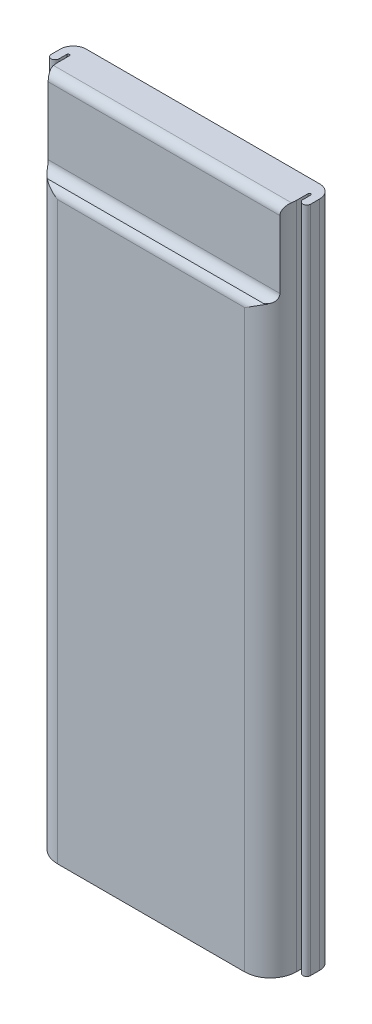
ISO-10303-21;
HEADER;
FILE_DESCRIPTION(('STEP AP214'),'2;1');
FILE_NAME('part.step','',(''),(''),'','','');
FILE_SCHEMA(('AUTOMOTIVE_DESIGN { 1 0 10303 214 1 1 1 1 }'));
ENDSEC;
DATA;
#1=APPLICATION_CONTEXT('core data for automotive mechanical design processes');
#2=APPLICATION_PROTOCOL_DEFINITION('international standard','automotive_design',2000,#1);
#3=PRODUCT_CONTEXT('',#1,'mechanical');
#4=PRODUCT('Part','Part','',(#3));
#5=PRODUCT_RELATED_PRODUCT_CATEGORY('part','',(#4));
#6=PRODUCT_DEFINITION_FORMATION('','',#4);
#7=PRODUCT_DEFINITION_CONTEXT('part definition',#1,'design');
#8=PRODUCT_DEFINITION('design','',#6,#7);
#9=PRODUCT_DEFINITION_SHAPE('','',#8);
#10=(LENGTH_UNIT() NAMED_UNIT(*) SI_UNIT(.MILLI.,.METRE.));
#11=(NAMED_UNIT(*) PLANE_ANGLE_UNIT() SI_UNIT($,.RADIAN.));
#12=(NAMED_UNIT(*) SI_UNIT($,.STERADIAN.) SOLID_ANGLE_UNIT());
#13=UNCERTAINTY_MEASURE_WITH_UNIT(LENGTH_MEASURE(1.E-05),#10,'distance_accuracy_value','');
#14=(GEOMETRIC_REPRESENTATION_CONTEXT(3) GLOBAL_UNCERTAINTY_ASSIGNED_CONTEXT((#13)) GLOBAL_UNIT_ASSIGNED_CONTEXT((#10,
#11,#12)) REPRESENTATION_CONTEXT('',''));
#15=CARTESIAN_POINT('',(0.,0.,0.));
#16=DIRECTION('',(0.,0.,1.));
#17=DIRECTION('',(1.,0.,0.));
#18=AXIS2_PLACEMENT_3D('',#15,#16,#17);
#19=CARTESIAN_POINT('',(-7.2,25.75,2.));
#20=DIRECTION('',(0.,-1.,0.));
#21=DIRECTION('',(0.,0.,-1.));
#22=AXIS2_PLACEMENT_3D('',#19,#20,#21);
#23=CYLINDRICAL_SURFACE('',#22,2.);
#24=CARTESIAN_POINT('',(-9.16913686675152,25.75,2.35));
#25=CARTESIAN_POINT('',(-9.16256093449206,25.7500258423735,2.38720826317085));
#26=CARTESIAN_POINT('',(-9.15486940976689,25.7468086891483,2.4241591284709));
#27=CARTESIAN_POINT('',(-9.13774343495875,25.7343318443298,2.49647410047727));
#28=CARTESIAN_POINT('',(-9.12831529903657,25.7250937449853,2.53184339647987));
#29=CARTESIAN_POINT('',(-9.10816469703338,25.7010290291053,2.6001553701829));
#30=CARTESIAN_POINT('',(-9.09744401727403,25.6862100665892,2.6331012978363));
#31=CARTESIAN_POINT('',(-9.0753021283148,25.6514586581588,2.69595344895339));
#32=CARTESIAN_POINT('',(-9.06388022167456,25.6315210564394,2.72585656485584));
#33=CARTESIAN_POINT('',(-9.04042958181792,25.5858190182926,2.78347824411278));
#34=CARTESIAN_POINT('',(-9.02840083308985,25.5598013830623,2.8109964779475));
#35=CARTESIAN_POINT('',(-9.00525838569287,25.5031420891217,2.86128360696459));
#36=CARTESIAN_POINT('',(-8.99414495701818,25.4724990735485,2.88405110382572));
#37=CARTESIAN_POINT('',(-8.97386355202712,25.4072504672174,2.92407369196035));
#38=CARTESIAN_POINT('',(-8.96469354608749,25.3726490691685,2.9413345437444));
#39=CARTESIAN_POINT('',(-8.94935335516006,25.3003858909545,2.9695485909417));
#40=CARTESIAN_POINT('',(-8.94317547200441,25.2627322584751,2.98051798664042));
#41=CARTESIAN_POINT('',(-8.93665873920537,25.2038592489191,2.99198602933503));
#42=CARTESIAN_POINT('',(-8.93494021604257,25.1832492223571,2.99498291355548));
#43=CARTESIAN_POINT('',(-8.93263293443128,25.1417652075219,2.99899212215603));
#44=CARTESIAN_POINT('',(-8.93204471811952,25.1208910974135,3.00000349421653));
#45=CARTESIAN_POINT('',(-8.93205080756888,25.1,3.));
#46=B_SPLINE_CURVE_WITH_KNOTS('',3,(#24,#25,#26,#27,#28,#29,#30,#31,#32,#33,#34,#35,#36,#37,#38,
#39,#40,#41,#42,#43,#44,#45),.UNSPECIFIED.,.F.,.F.,(4,2,2,2,2,2,2,2,2,2,4),(0.,
0.113115292878996,0.225827148620393,0.338384982404669,0.45105663917476,0.569711468956826,
0.688401174223788,0.806966307735266,0.925224753327533,0.98780357331846,1.05041240092788),.UNSPECIFIED.);
#47=CARTESIAN_POINT('',(-9.16913686675152,25.75,2.35));
#48=VERTEX_POINT('',#47);
#49=CARTESIAN_POINT('',(-8.93205080756888,25.1,3.));
#50=VERTEX_POINT('',#49);
#51=EDGE_CURVE('E361',#48,#50,#46,.T.);
#52=ORIENTED_EDGE('',*,*,#51,.F.);
#53=CARTESIAN_POINT('',(-7.2,25.75,2.));
#54=DIRECTION('',(0.,1.,0.));
#55=DIRECTION('',(0.,0.,1.));
#56=AXIS2_PLACEMENT_3D('',#53,#54,#55);
#57=CIRCLE('',#56,2.);
#58=CARTESIAN_POINT('',(-9.2,25.75,2.));
#59=VERTEX_POINT('',#58);
#60=EDGE_CURVE('E276',#59,#48,#57,.T.);
#61=ORIENTED_EDGE('',*,*,#60,.F.);
#62=DIRECTION('',(0.,-1.,0.));
#63=VECTOR('',#62,1.);
#64=CARTESIAN_POINT('',(-9.2,25.75,2.));
#65=LINE('',#64,#63);
#66=CARTESIAN_POINT('',(-9.2,-25.75,2.));
#67=VERTEX_POINT('',#66);
#68=EDGE_CURVE('E239',#59,#67,#65,.T.);
#69=ORIENTED_EDGE('',*,*,#68,.T.);
#70=CARTESIAN_POINT('',(-7.2,-25.75,2.));
#71=DIRECTION('',(0.,1.,0.));
#72=DIRECTION('',(0.,0.,1.));
#73=AXIS2_PLACEMENT_3D('',#70,#71,#72);
#74=CIRCLE('',#73,2.);
#75=CARTESIAN_POINT('',(-7.2,-25.75,4.));
#76=VERTEX_POINT('',#75);
#77=EDGE_CURVE('E199',#67,#76,#74,.T.);
#78=ORIENTED_EDGE('',*,*,#77,.T.);
#79=DIRECTION('',(0.,-1.,0.));
#80=VECTOR('',#79,1.);
#81=CARTESIAN_POINT('',(-7.2,25.75,4.));
#82=LINE('',#81,#80);
#83=CARTESIAN_POINT('',(-7.2,18.6,4.));
#84=VERTEX_POINT('',#83);
#85=EDGE_CURVE('E237',#84,#76,#82,.T.);
#86=ORIENTED_EDGE('',*,*,#85,.F.);
#87=CARTESIAN_POINT('',(-8.67563545633737,19.25,3.35));
#88=CARTESIAN_POINT('',(-8.65267478881206,19.2499932469629,3.37510429602965));
#89=CARTESIAN_POINT('',(-8.62909296700803,19.2485470125779,3.39958775562649));
#90=CARTESIAN_POINT('',(-8.58090677814626,19.2431451991544,3.44714747151513));
#91=CARTESIAN_POINT('',(-8.55630445000615,19.23919441785,3.47022632604329));
#92=CARTESIAN_POINT('',(-8.48165858361407,19.2242282759658,3.53680407014389));
#93=CARTESIAN_POINT('',(-8.4303126692842,19.2100840157248,3.57814755553334));
#94=CARTESIAN_POINT('',(-8.30085412905085,19.1677087843941,3.67247974823716));
#95=CARTESIAN_POINT('',(-8.22137535830939,19.1359868263596,3.72197198080512));
#96=CARTESIAN_POINT('',(-8.05896844639047,19.0641624891678,3.80851066967203));
#97=CARTESIAN_POINT('',(-7.9760211472614,19.024006663803,3.84547362186482));
#98=CARTESIAN_POINT('',(-7.7799445242252,18.9241623799291,3.91780631918262));
#99=CARTESIAN_POINT('',(-7.6660940623516,18.8624606757062,3.94841050017293));
#100=CARTESIAN_POINT('',(-7.4373647936438,18.7352882861594,3.98924690264115));
#101=CARTESIAN_POINT('',(-7.32249007895463,18.6698294206408,3.99953975746523));
#102=CARTESIAN_POINT('',(-7.20518011405637,18.6029531167111,3.99999495627204));
#103=CARTESIAN_POINT('',(-7.20259001272552,18.6014765316063,3.99999998679931));
#104=CARTESIAN_POINT('',(-7.2,18.6,4.));
#105=B_SPLINE_CURVE_WITH_KNOTS('',3,(#87,#88,#89,#90,#91,#92,#93,#94,#95,#96,#97,#98,#99,#100,
#101,#102,#103,#104),.UNSPECIFIED.,.F.,.F.,(4,2,2,2,2,2,2,2,4),(0.,0.101961062793666,
0.203727395778633,0.405233373896117,0.700228855017826,0.997153423353588,1.39448612501563,
1.79063090440369,1.79957518905045),.UNSPECIFIED.);
#106=CARTESIAN_POINT('',(-8.67563545633737,19.25,3.35));
#107=VERTEX_POINT('',#106);
#108=EDGE_CURVE('E485',#107,#84,#105,.T.);
#109=ORIENTED_EDGE('',*,*,#108,.F.);
#110=CARTESIAN_POINT('',(-7.2,19.25,2.));
#111=DIRECTION('',(0.,1.,0.));
#112=DIRECTION('',(0.,0.,1.));
#113=AXIS2_PLACEMENT_3D('',#110,#111,#112);
#114=CIRCLE('',#113,2.);
#115=CARTESIAN_POINT('',(-8.33026545554573,19.25,3.65));
#116=VERTEX_POINT('',#115);
#117=EDGE_CURVE('E472',#116,#107,#114,.F.);
#118=ORIENTED_EDGE('',*,*,#117,.F.);
#119=CARTESIAN_POINT('',(-8.93205080756888,19.9,3.));
#120=CARTESIAN_POINT('',(-8.93204988623455,19.8676904752637,2.99995637373617));
#121=CARTESIAN_POINT('',(-8.93066131428768,19.835399718107,3.00240624212551));
#122=CARTESIAN_POINT('',(-8.92510400689221,19.7718433795202,3.01196361528386));
#123=CARTESIAN_POINT('',(-8.92094245391935,19.7405753679502,3.01905908635504));
#124=CARTESIAN_POINT('',(-8.90983416071759,19.6798746802876,3.0375818204953));
#125=CARTESIAN_POINT('',(-8.90288728901374,19.6504420909079,3.04900928804553));
#126=CARTESIAN_POINT('',(-8.88621858955378,19.5941707847135,3.07559922742473));
#127=CARTESIAN_POINT('',(-8.87649641391036,19.5673323936493,3.0907621674665));
#128=CARTESIAN_POINT('',(-8.85409083375908,19.516254680954,3.1244553599774));
#129=CARTESIAN_POINT('',(-8.84134519368793,19.4920882262506,3.14305426413868));
#130=CARTESIAN_POINT('',(-8.81317080775485,19.4474332858953,3.1824834363641));
#131=CARTESIAN_POINT('',(-8.79774123562226,19.4269459368455,3.20331439082274));
#132=CARTESIAN_POINT('',(-8.76280806476325,19.3879500609207,3.24840634390461));
#133=CARTESIAN_POINT('',(-8.74305462499082,19.369825351411,3.27280414969983));
#134=CARTESIAN_POINT('',(-8.70095470907995,19.3379429141754,3.3221924169791));
#135=CARTESIAN_POINT('',(-8.67860643350929,19.3241882419212,3.34718328005779));
#136=CARTESIAN_POINT('',(-8.61873388256302,19.2941562289398,3.41067165885458));
#137=CARTESIAN_POINT('',(-8.57964020512821,19.2806749993229,3.44901278827458));
#138=CARTESIAN_POINT('',(-8.49736567267424,19.2613462944384,3.52313115070138));
#139=CARTESIAN_POINT('',(-8.45417760066265,19.2555125777892,3.55890365354961));
#140=CARTESIAN_POINT('',(-8.39650689788903,19.2516483800652,3.60269737947491));
#141=CARTESIAN_POINT('',(-8.38339790609193,19.2510181349906,3.61240082170023));
#142=CARTESIAN_POINT('',(-8.35698557187479,19.2501947715259,3.63145570810274));
#143=CARTESIAN_POINT('',(-8.34368311346722,19.2500000660377,3.64080830778722));
#144=CARTESIAN_POINT('',(-8.33026545554573,19.25,3.65000000000001));
#145=B_SPLINE_CURVE_WITH_KNOTS('',3,(#119,#120,#121,#122,#123,#124,#125,#126,#127,#128,#129,
#130,#131,#132,#133,#134,#135,#136,#137,#138,#139,#140,#141,#142,#143,#144),.UNSPECIFIED.,.F.,
.F.,(4,2,2,2,2,2,2,2,2,2,2,2,4),(0.,0.0967772461247654,0.193304792683902,0.289836896153852,
0.386381105343508,0.485117841590144,0.583885028728736,0.692217796210262,0.800626142667606,
0.96885466351209,1.13738543030932,1.18634519502088,1.23512625858873),.UNSPECIFIED.);
#146=CARTESIAN_POINT('',(-8.93205080756888,19.9,3.));
#147=VERTEX_POINT('',#146);
#148=EDGE_CURVE('E467',#147,#116,#145,.T.);
#149=ORIENTED_EDGE('',*,*,#148,.F.);
#150=DIRECTION('',(0.,-1.,0.));
#151=VECTOR('',#150,1.);
#152=CARTESIAN_POINT('',(-8.93205080756888,25.75,3.));
#153=LINE('',#152,#151);
#154=EDGE_CURVE('E466',#50,#147,#153,.T.);
#155=ORIENTED_EDGE('',*,*,#154,.F.);
#156=EDGE_LOOP('',(#52,#61,#69,#78,#86,#109,#118,#149,#155));
#157=FACE_BOUND('',#156,.T.);
#158=ADVANCED_FACE('F35',(#157),#23,.T.);
#159=CARTESIAN_POINT('',(7.2,25.75,2.));
#160=DIRECTION('',(0.,-1.,0.));
#161=DIRECTION('',(0.,0.,-1.));
#162=AXIS2_PLACEMENT_3D('',#159,#160,#161);
#163=CYLINDRICAL_SURFACE('',#162,2.);
#164=CARTESIAN_POINT('',(9.16913686675152,25.75,2.35));
#165=CARTESIAN_POINT('',(9.16256093449205,25.7500258423735,2.38720826317085));
#166=CARTESIAN_POINT('',(9.15486940976689,25.7468086891483,2.4241591284709));
#167=CARTESIAN_POINT('',(9.13774343495874,25.7343318443298,2.49647410047727));
#168=CARTESIAN_POINT('',(9.12831529903657,25.7250937449853,2.53184339647987));
#169=CARTESIAN_POINT('',(9.10816469703338,25.7010290291053,2.6001553701829));
#170=CARTESIAN_POINT('',(9.09744401727402,25.6862100665892,2.6331012978363));
#171=CARTESIAN_POINT('',(9.0753021283148,25.6514586581588,2.69595344895339));
#172=CARTESIAN_POINT('',(9.06388022167456,25.6315210564394,2.72585656485584));
#173=CARTESIAN_POINT('',(9.04042958181792,25.5858190182926,2.78347824411278));
#174=CARTESIAN_POINT('',(9.02840083308985,25.5598013830623,2.8109964779475));
#175=CARTESIAN_POINT('',(9.00525838569287,25.5031420891217,2.86128360696459));
#176=CARTESIAN_POINT('',(8.99414495701817,25.4724990735485,2.88405110382572));
#177=CARTESIAN_POINT('',(8.97386355202711,25.4072504672174,2.92407369196035));
#178=CARTESIAN_POINT('',(8.96469354608748,25.3726490691685,2.9413345437444));
#179=CARTESIAN_POINT('',(8.94935335516005,25.3003858909545,2.9695485909417));
#180=CARTESIAN_POINT('',(8.9431754720044,25.2627322584751,2.98051798664042));
#181=CARTESIAN_POINT('',(8.93665873920536,25.2038592489191,2.99198602933503));
#182=CARTESIAN_POINT('',(8.93494021604256,25.1832492223571,2.99498291355548));
#183=CARTESIAN_POINT('',(8.93263293443127,25.1417652075219,2.99899212215603));
#184=CARTESIAN_POINT('',(8.93204471811952,25.1208910974135,3.00000349421653));
#185=CARTESIAN_POINT('',(8.93205080756887,25.1,3.));
#186=B_SPLINE_CURVE_WITH_KNOTS('',3,(#164,#165,#166,#167,#168,#169,#170,#171,#172,#173,#174,
#175,#176,#177,#178,#179,#180,#181,#182,#183,#184,#185),.UNSPECIFIED.,.F.,.F.,(4,2,2,2,2,2,2,2,
2,2,4),(0.,0.113115292878996,0.225827148620394,0.33838498240467,0.45105663917476,
0.569711468956826,0.688401174223788,0.806966307735262,0.925224753327533,0.98780357331846,
1.05041240092788),.UNSPECIFIED.);
#187=CARTESIAN_POINT('',(9.16913686675152,25.75,2.35));
#188=VERTEX_POINT('',#187);
#189=CARTESIAN_POINT('',(8.93205080756887,25.1,3.));
#190=VERTEX_POINT('',#189);
#191=EDGE_CURVE('E50',#188,#190,#186,.T.);
#192=ORIENTED_EDGE('',*,*,#191,.T.);
#193=DIRECTION('',(0.,-1.,0.));
#194=VECTOR('',#193,1.);
#195=CARTESIAN_POINT('',(8.93205080756887,25.75,3.));
#196=LINE('',#195,#194);
#197=CARTESIAN_POINT('',(8.93205080756887,19.9,3.));
#198=VERTEX_POINT('',#197);
#199=EDGE_CURVE('E189',#190,#198,#196,.T.);
#200=ORIENTED_EDGE('',*,*,#199,.T.);
#201=CARTESIAN_POINT('',(8.93205080756887,19.9,3.));
#202=CARTESIAN_POINT('',(8.93204988623454,19.8676904752637,2.99995637373617));
#203=CARTESIAN_POINT('',(8.93066131428768,19.835399718107,3.00240624212551));
#204=CARTESIAN_POINT('',(8.92510400689221,19.7718433795202,3.01196361528386));
#205=CARTESIAN_POINT('',(8.92094245391935,19.7405753679502,3.01905908635504));
#206=CARTESIAN_POINT('',(8.90983416071759,19.6798746802876,3.0375818204953));
#207=CARTESIAN_POINT('',(8.90288728901374,19.6504420909079,3.04900928804553));
#208=CARTESIAN_POINT('',(8.88621858955377,19.5941707847135,3.07559922742473));
#209=CARTESIAN_POINT('',(8.87649641391035,19.5673323936493,3.0907621674665));
#210=CARTESIAN_POINT('',(8.85409083375908,19.516254680954,3.1244553599774));
#211=CARTESIAN_POINT('',(8.84134519368793,19.4920882262506,3.14305426413869));
#212=CARTESIAN_POINT('',(8.81317080775485,19.4474332858953,3.1824834363641));
#213=CARTESIAN_POINT('',(8.79774123562226,19.4269459368455,3.20331439082274));
#214=CARTESIAN_POINT('',(8.76280806476324,19.3879500609207,3.24840634390461));
#215=CARTESIAN_POINT('',(8.74305462499082,19.369825351411,3.27280414969983));
#216=CARTESIAN_POINT('',(8.70095470907994,19.3379429141754,3.3221924169791));
#217=CARTESIAN_POINT('',(8.67860643350928,19.3241882419212,3.34718328005779));
#218=CARTESIAN_POINT('',(8.61873388256302,19.2941562289398,3.41067165885458));
#219=CARTESIAN_POINT('',(8.5796402051282,19.2806749993229,3.44901278827458));
#220=CARTESIAN_POINT('',(8.49736567267424,19.2613462944384,3.52313115070139));
#221=CARTESIAN_POINT('',(8.45417760066264,19.2555125777892,3.55890365354961));
#222=CARTESIAN_POINT('',(8.39650689788902,19.2516483800652,3.60269737947491));
#223=CARTESIAN_POINT('',(8.38339790609192,19.2510181349906,3.61240082170024));
#224=CARTESIAN_POINT('',(8.35698557187478,19.2501947715259,3.63145570810274));
#225=CARTESIAN_POINT('',(8.34368311346722,19.2500000660377,3.64080830778722));
#226=CARTESIAN_POINT('',(8.33026545554573,19.25,3.65000000000001));
#227=B_SPLINE_CURVE_WITH_KNOTS('',3,(#201,#202,#203,#204,#205,#206,#207,#208,#209,#210,#211,
#212,#213,#214,#215,#216,#217,#218,#219,#220,#221,#222,#223,#224,#225,#226),.UNSPECIFIED.,.F.,
.F.,(4,2,2,2,2,2,2,2,2,2,2,2,4),(0.,0.0967772461247655,0.193304792683901,0.289836896153852,
0.386381105343508,0.485117841590144,0.583885028728737,0.692217796210264,0.800626142667607,
0.968854663512092,1.13738543030932,1.18634519502088,1.23512625858873),.UNSPECIFIED.);
#228=CARTESIAN_POINT('',(8.33026545554573,19.25,3.65));
#229=VERTEX_POINT('',#228);
#230=EDGE_CURVE('E353',#198,#229,#227,.T.);
#231=ORIENTED_EDGE('',*,*,#230,.T.);
#232=CARTESIAN_POINT('',(7.2,19.25,2.));
#233=DIRECTION('',(0.,-1.,0.));
#234=DIRECTION('',(0.,0.,-1.));
#235=AXIS2_PLACEMENT_3D('',#232,#233,#234);
#236=CIRCLE('',#235,2.);
#237=CARTESIAN_POINT('',(8.67563545633737,19.25,3.35));
#238=VERTEX_POINT('',#237);
#239=EDGE_CURVE('E360',#229,#238,#236,.F.);
#240=ORIENTED_EDGE('',*,*,#239,.T.);
#241=CARTESIAN_POINT('',(8.67563545633737,19.25,3.35));
#242=CARTESIAN_POINT('',(8.65267478881205,19.2499932469629,3.37510429602965));
#243=CARTESIAN_POINT('',(8.62909296700802,19.2485470125779,3.3995877556265));
#244=CARTESIAN_POINT('',(8.58090677814624,19.2431451991543,3.44714747151514));
#245=CARTESIAN_POINT('',(8.55630445000613,19.23919441785,3.4702263260433));
#246=CARTESIAN_POINT('',(8.48165858361405,19.2242282759658,3.5368040701439));
#247=CARTESIAN_POINT('',(8.43031266928418,19.2100840157248,3.57814755553335));
#248=CARTESIAN_POINT('',(8.30085412905085,19.1677087843941,3.67247974823716));
#249=CARTESIAN_POINT('',(8.2213753583094,19.1359868263595,3.72197198080511));
#250=CARTESIAN_POINT('',(8.05896844639047,19.0641624891678,3.80851066967202));
#251=CARTESIAN_POINT('',(7.97602114726137,19.024006663803,3.84547362186481));
#252=CARTESIAN_POINT('',(7.77994452422524,18.9241623799291,3.91780631918262));
#253=CARTESIAN_POINT('',(7.66609406235176,18.8624606757059,3.94841050017293));
#254=CARTESIAN_POINT('',(7.43736479364361,18.7352882861597,3.98924690264115));
#255=CARTESIAN_POINT('',(7.32249007895396,18.6698294206419,3.99953975746523));
#256=CARTESIAN_POINT('',(7.20518011405633,18.6029531167111,3.99999495627204));
#257=CARTESIAN_POINT('',(7.2025900127255,18.6014765316063,3.99999998679931));
#258=CARTESIAN_POINT('',(7.2,18.6,4.));
#259=B_SPLINE_CURVE_WITH_KNOTS('',3,(#241,#242,#243,#244,#245,#246,#247,#248,#249,#250,#251,
#252,#253,#254,#255,#256,#257,#258),.UNSPECIFIED.,.F.,.F.,(4,2,2,2,2,2,2,2,4),(0.,
0.10196106279368,0.203727395778663,0.405233373896117,0.700228855017801,0.997153423353587,
1.39448612501564,1.79063090440369,1.79957518905045),.UNSPECIFIED.);
#260=CARTESIAN_POINT('',(7.2,18.6,4.));
#261=VERTEX_POINT('',#260);
#262=EDGE_CURVE('E333',#238,#261,#259,.T.);
#263=ORIENTED_EDGE('',*,*,#262,.T.);
#264=DIRECTION('',(0.,-1.,0.));
#265=VECTOR('',#264,1.);
#266=CARTESIAN_POINT('',(7.2,25.75,4.));
#267=LINE('',#266,#265);
#268=CARTESIAN_POINT('',(7.2,-25.75,4.));
#269=VERTEX_POINT('',#268);
#270=EDGE_CURVE('E235',#261,#269,#267,.T.);
#271=ORIENTED_EDGE('',*,*,#270,.T.);
#272=CARTESIAN_POINT('',(7.2,-25.75,2.));
#273=DIRECTION('',(0.,1.,0.));
#274=DIRECTION('',(0.,0.,-1.));
#275=AXIS2_PLACEMENT_3D('',#272,#273,#274);
#276=CIRCLE('',#275,2.);
#277=CARTESIAN_POINT('',(9.2,-25.75,2.));
#278=VERTEX_POINT('',#277);
#279=EDGE_CURVE('E205',#269,#278,#276,.T.);
#280=ORIENTED_EDGE('',*,*,#279,.T.);
#281=DIRECTION('',(0.,-1.,0.));
#282=VECTOR('',#281,1.);
#283=CARTESIAN_POINT('',(9.2,25.75,2.));
#284=LINE('',#283,#282);
#285=CARTESIAN_POINT('',(9.2,25.75,2.));
#286=VERTEX_POINT('',#285);
#287=EDGE_CURVE('E232',#286,#278,#284,.T.);
#288=ORIENTED_EDGE('',*,*,#287,.F.);
#289=CARTESIAN_POINT('',(7.2,25.75,2.));
#290=DIRECTION('',(0.,1.,0.));
#291=DIRECTION('',(0.,0.,-1.));
#292=AXIS2_PLACEMENT_3D('',#289,#290,#291);
#293=CIRCLE('',#292,2.);
#294=EDGE_CURVE('E283',#188,#286,#293,.T.);
#295=ORIENTED_EDGE('',*,*,#294,.F.);
#296=EDGE_LOOP('',(#192,#200,#231,#240,#263,#271,#280,#288,#295));
#297=FACE_BOUND('',#296,.T.);
#298=ADVANCED_FACE('F384',(#297),#163,.T.);
#299=CARTESIAN_POINT('',(-9.,25.75,1.));
#300=DIRECTION('',(0.,1.,0.));
#301=DIRECTION('',(0.,0.,1.));
#302=AXIS2_PLACEMENT_3D('',#299,#300,#301);
#303=PLANE('',#302);
#304=DIRECTION('',(-1.,0.,0.));
#305=VECTOR('',#304,1.);
#306=CARTESIAN_POINT('',(10.001,25.75,2.35));
#307=LINE('',#306,#305);
#308=EDGE_CURVE('E309',#188,#48,#307,.T.);
#309=ORIENTED_EDGE('',*,*,#308,.F.);
#310=ORIENTED_EDGE('',*,*,#294,.T.);
#311=DIRECTION('',(0.,0.,-1.));
#312=VECTOR('',#311,1.);
#313=CARTESIAN_POINT('',(9.2,25.75,1.10000000000001));
#314=LINE('',#313,#312);
#315=CARTESIAN_POINT('',(9.2,25.75,1.10000000000001));
#316=VERTEX_POINT('',#315);
#317=EDGE_CURVE('E285',#286,#316,#314,.T.);
#318=ORIENTED_EDGE('',*,*,#317,.T.);
#319=CARTESIAN_POINT('',(9.3,25.75,1.10000000000001));
#320=DIRECTION('',(0.,-1.,0.));
#321=DIRECTION('',(0.,0.,-1.));
#322=AXIS2_PLACEMENT_3D('',#319,#320,#321);
#323=CIRCLE('',#322,0.0999999999999977);
#324=CARTESIAN_POINT('',(9.39999999999999,25.75,1.10000000000001));
#325=VERTEX_POINT('',#324);
#326=EDGE_CURVE('E287',#316,#325,#323,.T.);
#327=ORIENTED_EDGE('',*,*,#326,.T.);
#328=DIRECTION('',(0.,0.,1.));
#329=VECTOR('',#328,1.);
#330=CARTESIAN_POINT('',(9.39999999999999,25.75,1.70000000000001));
#331=LINE('',#330,#329);
#332=CARTESIAN_POINT('',(9.39999999999999,25.75,1.70000000000001));
#333=VERTEX_POINT('',#332);
#334=EDGE_CURVE('E289',#325,#333,#331,.T.);
#335=ORIENTED_EDGE('',*,*,#334,.T.);
#336=CARTESIAN_POINT('',(9.7,25.75,1.70000000000001));
#337=DIRECTION('',(0.,1.,0.));
#338=DIRECTION('',(0.,0.,-1.));
#339=AXIS2_PLACEMENT_3D('',#336,#337,#338);
#340=CIRCLE('',#339,0.300000000000005);
#341=CARTESIAN_POINT('',(10.,25.75,1.70000000000001));
#342=VERTEX_POINT('',#341);
#343=EDGE_CURVE('E164',#333,#342,#340,.T.);
#344=ORIENTED_EDGE('',*,*,#343,.T.);
#345=DIRECTION('',(0.,0.,-1.));
#346=VECTOR('',#345,1.);
#347=CARTESIAN_POINT('',(10.,25.75,1.));
#348=LINE('',#347,#346);
#349=CARTESIAN_POINT('',(10.,25.75,1.));
#350=VERTEX_POINT('',#349);
#351=EDGE_CURVE('E157',#342,#350,#348,.T.);
#352=ORIENTED_EDGE('',*,*,#351,.T.);
#353=CARTESIAN_POINT('',(9.,25.75,1.));
#354=DIRECTION('',(0.,1.,0.));
#355=DIRECTION('',(0.,0.,-1.));
#356=AXIS2_PLACEMENT_3D('',#353,#354,#355);
#357=CIRCLE('',#356,1.);
#358=CARTESIAN_POINT('',(9.,25.75,0.));
#359=VERTEX_POINT('',#358);
#360=EDGE_CURVE('E161',#350,#359,#357,.T.);
#361=ORIENTED_EDGE('',*,*,#360,.T.);
#362=DIRECTION('',(-1.,0.,0.));
#363=VECTOR('',#362,1.);
#364=CARTESIAN_POINT('',(-9.,25.75,0.));
#365=LINE('',#364,#363);
#366=CARTESIAN_POINT('',(-9.,25.75,0.));
#367=VERTEX_POINT('',#366);
#368=EDGE_CURVE('E59',#359,#367,#365,.T.);
#369=ORIENTED_EDGE('',*,*,#368,.T.);
#370=CARTESIAN_POINT('',(-9.,25.75,1.));
#371=DIRECTION('',(0.,1.,0.));
#372=DIRECTION('',(0.,0.,1.));
#373=AXIS2_PLACEMENT_3D('',#370,#371,#372);
#374=CIRCLE('',#373,1.);
#375=CARTESIAN_POINT('',(-10.,25.75,1.));
#376=VERTEX_POINT('',#375);
#377=EDGE_CURVE('E219',#367,#376,#374,.T.);
#378=ORIENTED_EDGE('',*,*,#377,.T.);
#379=DIRECTION('',(0.,0.,1.));
#380=VECTOR('',#379,1.);
#381=CARTESIAN_POINT('',(-10.,25.75,1.));
#382=LINE('',#381,#380);
#383=CARTESIAN_POINT('',(-10.,25.75,1.7));
#384=VERTEX_POINT('',#383);
#385=EDGE_CURVE('E124',#376,#384,#382,.T.);
#386=ORIENTED_EDGE('',*,*,#385,.T.);
#387=CARTESIAN_POINT('',(-9.7,25.75,1.7));
#388=DIRECTION('',(0.,1.,0.));
#389=DIRECTION('',(0.,0.,1.));
#390=AXIS2_PLACEMENT_3D('',#387,#388,#389);
#391=CIRCLE('',#390,0.300000000000002);
#392=CARTESIAN_POINT('',(-9.4,25.75,1.7));
#393=VERTEX_POINT('',#392);
#394=EDGE_CURVE('E256',#384,#393,#391,.T.);
#395=ORIENTED_EDGE('',*,*,#394,.T.);
#396=DIRECTION('',(0.,0.,-1.));
#397=VECTOR('',#396,1.);
#398=CARTESIAN_POINT('',(-9.4,25.75,1.7));
#399=LINE('',#398,#397);
#400=CARTESIAN_POINT('',(-9.4,25.75,1.1));
#401=VERTEX_POINT('',#400);
#402=EDGE_CURVE('E274',#393,#401,#399,.T.);
#403=ORIENTED_EDGE('',*,*,#402,.T.);
#404=CARTESIAN_POINT('',(-9.3,25.75,1.1));
#405=DIRECTION('',(0.,-1.,0.));
#406=DIRECTION('',(0.,0.,1.));
#407=AXIS2_PLACEMENT_3D('',#404,#405,#406);
#408=CIRCLE('',#407,0.0999999999999994);
#409=CARTESIAN_POINT('',(-9.2,25.75,1.1));
#410=VERTEX_POINT('',#409);
#411=EDGE_CURVE('E271',#401,#410,#408,.T.);
#412=ORIENTED_EDGE('',*,*,#411,.T.);
#413=DIRECTION('',(0.,0.,1.));
#414=VECTOR('',#413,1.);
#415=CARTESIAN_POINT('',(-9.2,25.75,2.));
#416=LINE('',#415,#414);
#417=EDGE_CURVE('E273',#410,#59,#416,.T.);
#418=ORIENTED_EDGE('',*,*,#417,.T.);
#419=ORIENTED_EDGE('',*,*,#60,.T.);
#420=EDGE_LOOP('',(#309,#310,#318,#327,#335,#344,#352,#361,#369,#378,#386,#395,#403,#412,#418,#419));
#421=FACE_BOUND('',#420,.T.);
#422=ADVANCED_FACE('F159',(#421),#303,.T.);
#423=CARTESIAN_POINT('',(-9.,25.75,1.));
#424=DIRECTION('',(0.,-1.,0.));
#425=DIRECTION('',(0.,0.,-1.));
#426=AXIS2_PLACEMENT_3D('',#423,#424,#425);
#427=CYLINDRICAL_SURFACE('',#426,1.);
#428=CARTESIAN_POINT('',(-9.,-25.75,1.));
#429=DIRECTION('',(0.,1.,0.));
#430=DIRECTION('',(0.,0.,1.));
#431=AXIS2_PLACEMENT_3D('',#428,#429,#430);
#432=CIRCLE('',#431,1.);
#433=CARTESIAN_POINT('',(-9.,-25.75,0.));
#434=VERTEX_POINT('',#433);
#435=CARTESIAN_POINT('',(-10.,-25.75,1.));
#436=VERTEX_POINT('',#435);
#437=EDGE_CURVE('E185',#434,#436,#432,.T.);
#438=ORIENTED_EDGE('',*,*,#437,.T.);
#439=DIRECTION('',(0.,-1.,0.));
#440=VECTOR('',#439,1.);
#441=CARTESIAN_POINT('',(-10.,25.75,1.));
#442=LINE('',#441,#440);
#443=EDGE_CURVE('E11',#376,#436,#442,.T.);
#444=ORIENTED_EDGE('',*,*,#443,.F.);
#445=ORIENTED_EDGE('',*,*,#377,.F.);
#446=DIRECTION('',(0.,-1.,0.));
#447=VECTOR('',#446,1.);
#448=CARTESIAN_POINT('',(-9.,25.75,0.));
#449=LINE('',#448,#447);
#450=EDGE_CURVE('E181',#367,#434,#449,.T.);
#451=ORIENTED_EDGE('',*,*,#450,.T.);
#452=EDGE_LOOP('',(#438,#444,#445,#451));
#453=FACE_BOUND('',#452,.T.);
#454=ADVANCED_FACE('F37',(#453),#427,.T.);
#455=CARTESIAN_POINT('',(-10.,25.75,1.));
#456=DIRECTION('',(1.,0.,0.));
#457=DIRECTION('',(0.,0.,-1.));
#458=AXIS2_PLACEMENT_3D('',#455,#456,#457);
#459=PLANE('',#458);
#460=DIRECTION('',(0.,0.,1.));
#461=VECTOR('',#460,1.);
#462=CARTESIAN_POINT('',(-10.,-25.75,1.));
#463=LINE('',#462,#461);
#464=CARTESIAN_POINT('',(-10.,-25.75,1.7));
#465=VERTEX_POINT('',#464);
#466=EDGE_CURVE('E188',#436,#465,#463,.T.);
#467=ORIENTED_EDGE('',*,*,#466,.T.);
#468=DIRECTION('',(0.,-1.,0.));
#469=VECTOR('',#468,1.);
#470=CARTESIAN_POINT('',(-10.,25.75,1.7));
#471=LINE('',#470,#469);
#472=EDGE_CURVE('E43',#384,#465,#471,.T.);
#473=ORIENTED_EDGE('',*,*,#472,.F.);
#474=ORIENTED_EDGE('',*,*,#385,.F.);
#475=ORIENTED_EDGE('',*,*,#443,.T.);
#476=EDGE_LOOP('',(#467,#473,#474,#475));
#477=FACE_BOUND('',#476,.T.);
#478=ADVANCED_FACE('F405',(#477),#459,.F.);
#479=CARTESIAN_POINT('',(-9.7,25.75,1.7));
#480=DIRECTION('',(0.,-1.,0.));
#481=DIRECTION('',(0.,0.,-1.));
#482=AXIS2_PLACEMENT_3D('',#479,#480,#481);
#483=CYLINDRICAL_SURFACE('',#482,0.300000000000002);
#484=CARTESIAN_POINT('',(-9.7,-25.75,1.7));
#485=DIRECTION('',(0.,1.,0.));
#486=DIRECTION('',(0.,0.,1.));
#487=AXIS2_PLACEMENT_3D('',#484,#485,#486);
#488=CIRCLE('',#487,0.300000000000002);
#489=CARTESIAN_POINT('',(-9.4,-25.75,1.7));
#490=VERTEX_POINT('',#489);
#491=EDGE_CURVE('E191',#465,#490,#488,.T.);
#492=ORIENTED_EDGE('',*,*,#491,.T.);
#493=DIRECTION('',(0.,-1.,0.));
#494=VECTOR('',#493,1.);
#495=CARTESIAN_POINT('',(-9.4,25.75,1.7));
#496=LINE('',#495,#494);
#497=EDGE_CURVE('E248',#393,#490,#496,.T.);
#498=ORIENTED_EDGE('',*,*,#497,.F.);
#499=ORIENTED_EDGE('',*,*,#394,.F.);
#500=ORIENTED_EDGE('',*,*,#472,.T.);
#501=EDGE_LOOP('',(#492,#498,#499,#500));
#502=FACE_BOUND('',#501,.T.);
#503=ADVANCED_FACE('F254',(#502),#483,.T.);
#504=CARTESIAN_POINT('',(-9.4,25.75,1.7));
#505=DIRECTION('',(-1.,0.,0.));
#506=DIRECTION('',(0.,0.,1.));
#507=AXIS2_PLACEMENT_3D('',#504,#505,#506);
#508=PLANE('',#507);
#509=DIRECTION('',(0.,0.,-1.));
#510=VECTOR('',#509,1.);
#511=CARTESIAN_POINT('',(-9.4,-25.75,1.7));
#512=LINE('',#511,#510);
#513=CARTESIAN_POINT('',(-9.4,-25.75,1.1));
#514=VERTEX_POINT('',#513);
#515=EDGE_CURVE('E193',#490,#514,#512,.T.);
#516=ORIENTED_EDGE('',*,*,#515,.T.);
#517=DIRECTION('',(0.,-1.,0.));
#518=VECTOR('',#517,1.);
#519=CARTESIAN_POINT('',(-9.4,25.75,1.1));
#520=LINE('',#519,#518);
#521=EDGE_CURVE('E245',#401,#514,#520,.T.);
#522=ORIENTED_EDGE('',*,*,#521,.F.);
#523=ORIENTED_EDGE('',*,*,#402,.F.);
#524=ORIENTED_EDGE('',*,*,#497,.T.);
#525=EDGE_LOOP('',(#516,#522,#523,#524));
#526=FACE_BOUND('',#525,.T.);
#527=ADVANCED_FACE('F265',(#526),#508,.F.);
#528=CARTESIAN_POINT('',(-9.3,25.75,1.1));
#529=DIRECTION('',(0.,-1.,0.));
#530=DIRECTION('',(0.,0.,-1.));
#531=AXIS2_PLACEMENT_3D('',#528,#529,#530);
#532=CYLINDRICAL_SURFACE('',#531,0.0999999999999994);
#533=CARTESIAN_POINT('',(-9.3,-25.75,1.1));
#534=DIRECTION('',(0.,-1.,0.));
#535=DIRECTION('',(0.,0.,1.));
#536=AXIS2_PLACEMENT_3D('',#533,#534,#535);
#537=CIRCLE('',#536,0.0999999999999994);
#538=CARTESIAN_POINT('',(-9.2,-25.75,1.1));
#539=VERTEX_POINT('',#538);
#540=EDGE_CURVE('E195',#514,#539,#537,.T.);
#541=ORIENTED_EDGE('',*,*,#540,.T.);
#542=DIRECTION('',(0.,-1.,0.));
#543=VECTOR('',#542,1.);
#544=CARTESIAN_POINT('',(-9.2,25.75,1.1));
#545=LINE('',#544,#543);
#546=EDGE_CURVE('E242',#410,#539,#545,.T.);
#547=ORIENTED_EDGE('',*,*,#546,.F.);
#548=ORIENTED_EDGE('',*,*,#411,.F.);
#549=ORIENTED_EDGE('',*,*,#521,.T.);
#550=EDGE_LOOP('',(#541,#547,#548,#549));
#551=FACE_BOUND('',#550,.T.);
#552=ADVANCED_FACE('F269',(#551),#532,.F.);
#553=CARTESIAN_POINT('',(-9.2,25.75,2.));
#554=DIRECTION('',(1.,0.,0.));
#555=DIRECTION('',(0.,0.,-1.));
#556=AXIS2_PLACEMENT_3D('',#553,#554,#555);
#557=PLANE('',#556);
#558=DIRECTION('',(0.,0.,1.));
#559=VECTOR('',#558,1.);
#560=CARTESIAN_POINT('',(-9.2,-25.75,2.));
#561=LINE('',#560,#559);
#562=EDGE_CURVE('E197',#539,#67,#561,.T.);
#563=ORIENTED_EDGE('',*,*,#562,.T.);
#564=ORIENTED_EDGE('',*,*,#68,.F.);
#565=ORIENTED_EDGE('',*,*,#417,.F.);
#566=ORIENTED_EDGE('',*,*,#546,.T.);
#567=EDGE_LOOP('',(#563,#564,#565,#566));
#568=FACE_BOUND('',#567,.T.);
#569=ADVANCED_FACE('F396',(#568),#557,.F.);
#570=CARTESIAN_POINT('',(-7.2,25.75,4.));
#571=DIRECTION('',(0.,0.,-1.));
#572=DIRECTION('',(-1.,0.,0.));
#573=AXIS2_PLACEMENT_3D('',#570,#571,#572);
#574=PLANE('',#573);
#575=ORIENTED_EDGE('',*,*,#270,.F.);
#576=DIRECTION('',(-1.,0.,0.));
#577=VECTOR('',#576,1.);
#578=CARTESIAN_POINT('',(10.001,18.6,4.));
#579=LINE('',#578,#577);
#580=EDGE_CURVE('E311',#261,#84,#579,.T.);
#581=ORIENTED_EDGE('',*,*,#580,.T.);
#582=ORIENTED_EDGE('',*,*,#85,.T.);
#583=DIRECTION('',(1.,0.,0.));
#584=VECTOR('',#583,1.);
#585=CARTESIAN_POINT('',(-7.2,-25.75,4.));
#586=LINE('',#585,#584);
#587=EDGE_CURVE('E202',#76,#269,#586,.T.);
#588=ORIENTED_EDGE('',*,*,#587,.T.);
#589=EDGE_LOOP('',(#575,#581,#582,#588));
#590=FACE_BOUND('',#589,.T.);
#591=ADVANCED_FACE('F395',(#590),#574,.F.);
#592=CARTESIAN_POINT('',(9.2,25.75,1.10000000000001));
#593=DIRECTION('',(-1.,0.,0.));
#594=DIRECTION('',(0.,0.,1.));
#595=AXIS2_PLACEMENT_3D('',#592,#593,#594);
#596=PLANE('',#595);
#597=DIRECTION('',(0.,0.,-1.));
#598=VECTOR('',#597,1.);
#599=CARTESIAN_POINT('',(9.2,-25.75,1.10000000000001));
#600=LINE('',#599,#598);
#601=CARTESIAN_POINT('',(9.2,-25.75,1.10000000000001));
#602=VERTEX_POINT('',#601);
#603=EDGE_CURVE('E207',#278,#602,#600,.T.);
#604=ORIENTED_EDGE('',*,*,#603,.T.);
#605=DIRECTION('',(0.,-1.,0.));
#606=VECTOR('',#605,1.);
#607=CARTESIAN_POINT('',(9.2,25.75,1.10000000000001));
#608=LINE('',#607,#606);
#609=EDGE_CURVE('E229',#316,#602,#608,.T.);
#610=ORIENTED_EDGE('',*,*,#609,.F.);
#611=ORIENTED_EDGE('',*,*,#317,.F.);
#612=ORIENTED_EDGE('',*,*,#287,.T.);
#613=EDGE_LOOP('',(#604,#610,#611,#612));
#614=FACE_BOUND('',#613,.T.);
#615=ADVANCED_FACE('F431',(#614),#596,.F.);
#616=CARTESIAN_POINT('',(9.3,25.75,1.10000000000001));
#617=DIRECTION('',(0.,-1.,0.));
#618=DIRECTION('',(0.,0.,-1.));
#619=AXIS2_PLACEMENT_3D('',#616,#617,#618);
#620=CYLINDRICAL_SURFACE('',#619,0.0999999999999977);
#621=CARTESIAN_POINT('',(9.3,-25.75,1.10000000000001));
#622=DIRECTION('',(0.,-1.,0.));
#623=DIRECTION('',(0.,0.,-1.));
#624=AXIS2_PLACEMENT_3D('',#621,#622,#623);
#625=CIRCLE('',#624,0.0999999999999977);
#626=CARTESIAN_POINT('',(9.39999999999999,-25.75,1.10000000000001));
#627=VERTEX_POINT('',#626);
#628=EDGE_CURVE('E209',#602,#627,#625,.T.);
#629=ORIENTED_EDGE('',*,*,#628,.T.);
#630=DIRECTION('',(0.,-1.,0.));
#631=VECTOR('',#630,1.);
#632=CARTESIAN_POINT('',(9.39999999999999,25.75,1.10000000000001));
#633=LINE('',#632,#631);
#634=EDGE_CURVE('E226',#325,#627,#633,.T.);
#635=ORIENTED_EDGE('',*,*,#634,.F.);
#636=ORIENTED_EDGE('',*,*,#326,.F.);
#637=ORIENTED_EDGE('',*,*,#609,.T.);
#638=EDGE_LOOP('',(#629,#635,#636,#637));
#639=FACE_BOUND('',#638,.T.);
#640=ADVANCED_FACE('F428',(#639),#620,.F.);
#641=CARTESIAN_POINT('',(9.39999999999999,25.75,1.70000000000001));
#642=DIRECTION('',(1.,0.,0.));
#643=DIRECTION('',(0.,0.,-1.));
#644=AXIS2_PLACEMENT_3D('',#641,#642,#643);
#645=PLANE('',#644);
#646=DIRECTION('',(0.,0.,1.));
#647=VECTOR('',#646,1.);
#648=CARTESIAN_POINT('',(9.39999999999999,-25.75,1.70000000000001));
#649=LINE('',#648,#647);
#650=CARTESIAN_POINT('',(9.39999999999999,-25.75,1.70000000000001));
#651=VERTEX_POINT('',#650);
#652=EDGE_CURVE('E211',#627,#651,#649,.T.);
#653=ORIENTED_EDGE('',*,*,#652,.T.);
#654=DIRECTION('',(0.,-1.,0.));
#655=VECTOR('',#654,1.);
#656=CARTESIAN_POINT('',(9.39999999999999,25.75,1.70000000000001));
#657=LINE('',#656,#655);
#658=EDGE_CURVE('E223',#333,#651,#657,.T.);
#659=ORIENTED_EDGE('',*,*,#658,.F.);
#660=ORIENTED_EDGE('',*,*,#334,.F.);
#661=ORIENTED_EDGE('',*,*,#634,.T.);
#662=EDGE_LOOP('',(#653,#659,#660,#661));
#663=FACE_BOUND('',#662,.T.);
#664=ADVANCED_FACE('F295',(#663),#645,.F.);
#665=CARTESIAN_POINT('',(9.7,25.75,1.70000000000001));
#666=DIRECTION('',(0.,-1.,0.));
#667=DIRECTION('',(0.,0.,-1.));
#668=AXIS2_PLACEMENT_3D('',#665,#666,#667);
#669=CYLINDRICAL_SURFACE('',#668,0.300000000000005);
#670=CARTESIAN_POINT('',(9.7,-25.75,1.70000000000001));
#671=DIRECTION('',(0.,1.,0.));
#672=DIRECTION('',(0.,0.,-1.));
#673=AXIS2_PLACEMENT_3D('',#670,#671,#672);
#674=CIRCLE('',#673,0.300000000000005);
#675=CARTESIAN_POINT('',(10.,-25.75,1.70000000000001));
#676=VERTEX_POINT('',#675);
#677=EDGE_CURVE('E213',#651,#676,#674,.T.);
#678=ORIENTED_EDGE('',*,*,#677,.T.);
#679=DIRECTION('',(0.,-1.,0.));
#680=VECTOR('',#679,1.);
#681=CARTESIAN_POINT('',(10.,25.75,1.70000000000001));
#682=LINE('',#681,#680);
#683=EDGE_CURVE('E176',#342,#676,#682,.T.);
#684=ORIENTED_EDGE('',*,*,#683,.F.);
#685=ORIENTED_EDGE('',*,*,#343,.F.);
#686=ORIENTED_EDGE('',*,*,#658,.T.);
#687=EDGE_LOOP('',(#678,#684,#685,#686));
#688=FACE_BOUND('',#687,.T.);
#689=ADVANCED_FACE('F299',(#688),#669,.T.);
#690=CARTESIAN_POINT('',(10.,25.75,1.));
#691=DIRECTION('',(-1.,0.,0.));
#692=DIRECTION('',(0.,0.,1.));
#693=AXIS2_PLACEMENT_3D('',#690,#691,#692);
#694=PLANE('',#693);
#695=DIRECTION('',(0.,0.,-1.));
#696=VECTOR('',#695,1.);
#697=CARTESIAN_POINT('',(10.,-25.75,1.));
#698=LINE('',#697,#696);
#699=CARTESIAN_POINT('',(10.,-25.75,1.));
#700=VERTEX_POINT('',#699);
#701=EDGE_CURVE('E173',#676,#700,#698,.T.);
#702=ORIENTED_EDGE('',*,*,#701,.T.);
#703=DIRECTION('',(0.,-1.,0.));
#704=VECTOR('',#703,1.);
#705=CARTESIAN_POINT('',(10.,25.75,1.));
#706=LINE('',#705,#704);
#707=EDGE_CURVE('E170',#350,#700,#706,.T.);
#708=ORIENTED_EDGE('',*,*,#707,.F.);
#709=ORIENTED_EDGE('',*,*,#351,.F.);
#710=ORIENTED_EDGE('',*,*,#683,.T.);
#711=EDGE_LOOP('',(#702,#708,#709,#710));
#712=FACE_BOUND('',#711,.T.);
#713=ADVANCED_FACE('F171',(#712),#694,.F.);
#714=CARTESIAN_POINT('',(9.,25.75,1.));
#715=DIRECTION('',(0.,-1.,0.));
#716=DIRECTION('',(0.,0.,-1.));
#717=AXIS2_PLACEMENT_3D('',#714,#715,#716);
#718=CYLINDRICAL_SURFACE('',#717,1.);
#719=CARTESIAN_POINT('',(9.,-25.75,1.));
#720=DIRECTION('',(0.,1.,0.));
#721=DIRECTION('',(0.,0.,-1.));
#722=AXIS2_PLACEMENT_3D('',#719,#720,#721);
#723=CIRCLE('',#722,1.);
#724=CARTESIAN_POINT('',(9.,-25.75,0.));
#725=VERTEX_POINT('',#724);
#726=EDGE_CURVE('E216',#700,#725,#723,.T.);
#727=ORIENTED_EDGE('',*,*,#726,.T.);
#728=DIRECTION('',(0.,-1.,0.));
#729=VECTOR('',#728,1.);
#730=CARTESIAN_POINT('',(9.,25.75,0.));
#731=LINE('',#730,#729);
#732=EDGE_CURVE('E177',#359,#725,#731,.T.);
#733=ORIENTED_EDGE('',*,*,#732,.F.);
#734=ORIENTED_EDGE('',*,*,#360,.F.);
#735=ORIENTED_EDGE('',*,*,#707,.T.);
#736=EDGE_LOOP('',(#727,#733,#734,#735));
#737=FACE_BOUND('',#736,.T.);
#738=ADVANCED_FACE('F179',(#737),#718,.T.);
#739=CARTESIAN_POINT('',(-9.,25.75,0.));
#740=DIRECTION('',(0.,0.,1.));
#741=DIRECTION('',(1.,0.,0.));
#742=AXIS2_PLACEMENT_3D('',#739,#740,#741);
#743=PLANE('',#742);
#744=DIRECTION('',(-1.,0.,0.));
#745=VECTOR('',#744,1.);
#746=CARTESIAN_POINT('',(-9.,-25.75,0.));
#747=LINE('',#746,#745);
#748=EDGE_CURVE('E116',#725,#434,#747,.T.);
#749=ORIENTED_EDGE('',*,*,#748,.T.);
#750=ORIENTED_EDGE('',*,*,#450,.F.);
#751=ORIENTED_EDGE('',*,*,#368,.F.);
#752=ORIENTED_EDGE('',*,*,#732,.T.);
#753=EDGE_LOOP('',(#749,#750,#751,#752));
#754=FACE_BOUND('',#753,.T.);
#755=ADVANCED_FACE('F300',(#754),#743,.F.);
#756=CARTESIAN_POINT('',(-9.,-25.75,1.));
#757=DIRECTION('',(0.,1.,0.));
#758=DIRECTION('',(0.,0.,1.));
#759=AXIS2_PLACEMENT_3D('',#756,#757,#758);
#760=PLANE('',#759);
#761=ORIENTED_EDGE('',*,*,#437,.F.);
#762=ORIENTED_EDGE('',*,*,#748,.F.);
#763=ORIENTED_EDGE('',*,*,#726,.F.);
#764=ORIENTED_EDGE('',*,*,#701,.F.);
#765=ORIENTED_EDGE('',*,*,#677,.F.);
#766=ORIENTED_EDGE('',*,*,#652,.F.);
#767=ORIENTED_EDGE('',*,*,#628,.F.);
#768=ORIENTED_EDGE('',*,*,#603,.F.);
#769=ORIENTED_EDGE('',*,*,#279,.F.);
#770=ORIENTED_EDGE('',*,*,#587,.F.);
#771=ORIENTED_EDGE('',*,*,#77,.F.);
#772=ORIENTED_EDGE('',*,*,#562,.F.);
#773=ORIENTED_EDGE('',*,*,#540,.F.);
#774=ORIENTED_EDGE('',*,*,#515,.F.);
#775=ORIENTED_EDGE('',*,*,#491,.F.);
#776=ORIENTED_EDGE('',*,*,#466,.F.);
#777=EDGE_LOOP('',(#761,#762,#763,#764,#765,#766,#767,#768,#769,#770,#771,#772,#773,#774,#775,#776));
#778=FACE_BOUND('',#777,.T.);
#779=ADVANCED_FACE('F260',(#778),#760,.F.);
#780=CARTESIAN_POINT('',(10.001,25.1,2.35));
#781=DIRECTION('',(-1.,0.,0.));
#782=DIRECTION('',(0.,0.,1.));
#783=AXIS2_PLACEMENT_3D('',#780,#781,#782);
#784=CYLINDRICAL_SURFACE('',#783,0.650000000000001);
#785=ORIENTED_EDGE('',*,*,#308,.T.);
#786=ORIENTED_EDGE('',*,*,#51,.T.);
#787=DIRECTION('',(-1.,0.,0.));
#788=VECTOR('',#787,1.);
#789=CARTESIAN_POINT('',(10.001,25.1,3.));
#790=LINE('',#789,#788);
#791=EDGE_CURVE('E323',#190,#50,#790,.T.);
#792=ORIENTED_EDGE('',*,*,#791,.F.);
#793=ORIENTED_EDGE('',*,*,#191,.F.);
#794=EDGE_LOOP('',(#785,#786,#792,#793));
#795=FACE_BOUND('',#794,.T.);
#796=ADVANCED_FACE('F340',(#795),#784,.T.);
#797=CARTESIAN_POINT('',(10.001,18.6,3.35));
#798=DIRECTION('',(-1.,0.,0.));
#799=DIRECTION('',(0.,0.,1.));
#800=AXIS2_PLACEMENT_3D('',#797,#798,#799);
#801=CYLINDRICAL_SURFACE('',#800,0.649999999999999);
#802=DIRECTION('',(-1.,0.,0.));
#803=VECTOR('',#802,1.);
#804=CARTESIAN_POINT('',(10.001,19.25,3.35));
#805=LINE('',#804,#803);
#806=EDGE_CURVE('E314',#238,#107,#805,.T.);
#807=ORIENTED_EDGE('',*,*,#806,.T.);
#808=ORIENTED_EDGE('',*,*,#108,.T.);
#809=ORIENTED_EDGE('',*,*,#580,.F.);
#810=ORIENTED_EDGE('',*,*,#262,.F.);
#811=EDGE_LOOP('',(#807,#808,#809,#810));
#812=FACE_BOUND('',#811,.T.);
#813=ADVANCED_FACE('F375',(#812),#801,.T.);
#814=CARTESIAN_POINT('',(10.001,19.25,3.65));
#815=DIRECTION('',(0.,-1.,0.));
#816=DIRECTION('',(0.,0.,-1.));
#817=AXIS2_PLACEMENT_3D('',#814,#815,#816);
#818=PLANE('',#817);
#819=DIRECTION('',(-1.,0.,0.));
#820=VECTOR('',#819,1.);
#821=CARTESIAN_POINT('',(10.001,19.25,3.65));
#822=LINE('',#821,#820);
#823=EDGE_CURVE('E317',#229,#116,#822,.T.);
#824=ORIENTED_EDGE('',*,*,#823,.T.);
#825=ORIENTED_EDGE('',*,*,#117,.T.);
#826=ORIENTED_EDGE('',*,*,#806,.F.);
#827=ORIENTED_EDGE('',*,*,#239,.F.);
#828=EDGE_LOOP('',(#824,#825,#826,#827));
#829=FACE_BOUND('',#828,.T.);
#830=ADVANCED_FACE('F372',(#829),#818,.T.);
#831=CARTESIAN_POINT('',(10.001,19.9,3.65));
#832=DIRECTION('',(-1.,0.,0.));
#833=DIRECTION('',(0.,0.,1.));
#834=AXIS2_PLACEMENT_3D('',#831,#832,#833);
#835=CYLINDRICAL_SURFACE('',#834,0.650000000000001);
#836=DIRECTION('',(-1.,0.,0.));
#837=VECTOR('',#836,1.);
#838=CARTESIAN_POINT('',(10.001,19.9,3.));
#839=LINE('',#838,#837);
#840=EDGE_CURVE('E320',#198,#147,#839,.T.);
#841=ORIENTED_EDGE('',*,*,#840,.T.);
#842=ORIENTED_EDGE('',*,*,#148,.T.);
#843=ORIENTED_EDGE('',*,*,#823,.F.);
#844=ORIENTED_EDGE('',*,*,#230,.F.);
#845=EDGE_LOOP('',(#841,#842,#843,#844));
#846=FACE_BOUND('',#845,.T.);
#847=ADVANCED_FACE('F368',(#846),#835,.F.);
#848=CARTESIAN_POINT('',(10.001,25.1,3.));
#849=DIRECTION('',(0.,0.,1.));
#850=DIRECTION('',(0.,-1.,0.));
#851=AXIS2_PLACEMENT_3D('',#848,#849,#850);
#852=PLANE('',#851);
#853=ORIENTED_EDGE('',*,*,#791,.T.);
#854=ORIENTED_EDGE('',*,*,#154,.T.);
#855=ORIENTED_EDGE('',*,*,#840,.F.);
#856=ORIENTED_EDGE('',*,*,#199,.F.);
#857=EDGE_LOOP('',(#853,#854,#855,#856));
#858=FACE_BOUND('',#857,.T.);
#859=ADVANCED_FACE('F348',(#858),#852,.T.);
#860=CLOSED_SHELL('',(#158,#298,#422,#454,#478,#503,#527,#552,#569,#591,#615,#640,#664,#689,
#713,#738,#755,#779,#796,#813,#830,#847,#859));
#861=MANIFOLD_SOLID_BREP('B2',#860);
#862=ADVANCED_BREP_SHAPE_REPRESENTATION('',(#18,#861),#14);
#863=SHAPE_DEFINITION_REPRESENTATION(#9,#862);
ENDSEC;
END-ISO-10303-21;
